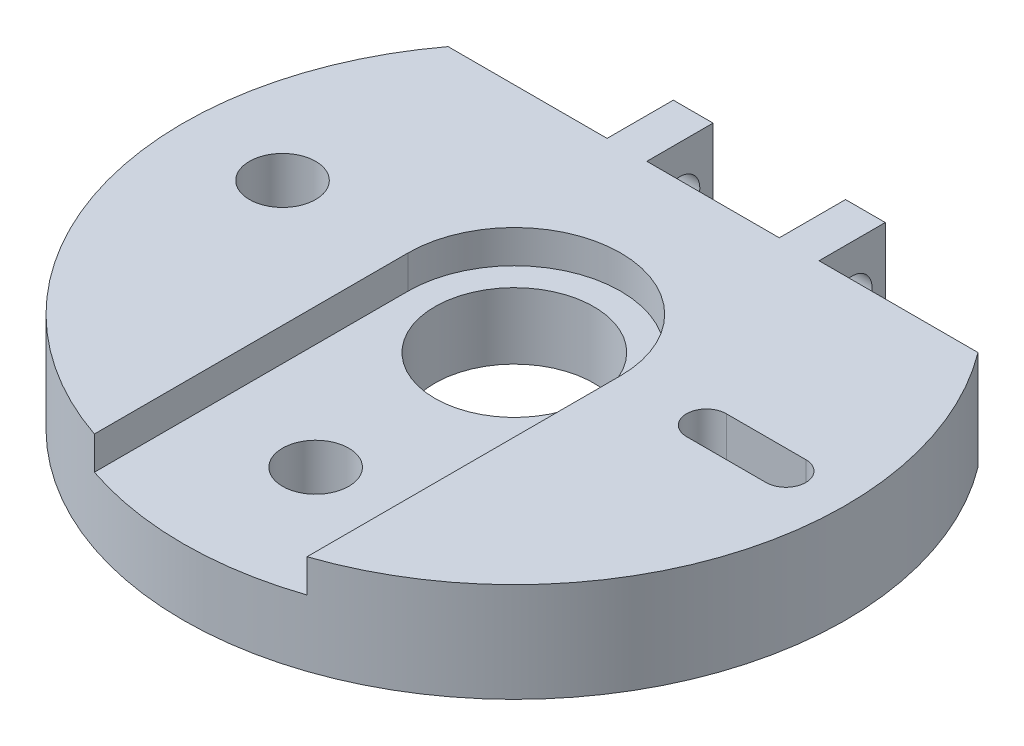
ISO-10303-21;
HEADER;
FILE_DESCRIPTION(('STEP AP214'),'2;1');
FILE_NAME('part.step','',(''),(''),'','','');
FILE_SCHEMA(('AUTOMOTIVE_DESIGN { 1 0 10303 214 1 1 1 1 }'));
ENDSEC;
DATA;
#1=APPLICATION_CONTEXT('core data for automotive mechanical design processes');
#2=APPLICATION_PROTOCOL_DEFINITION('international standard','automotive_design',2000,#1);
#3=PRODUCT_CONTEXT('',#1,'mechanical');
#4=PRODUCT('Part','Part','',(#3));
#5=PRODUCT_RELATED_PRODUCT_CATEGORY('part','',(#4));
#6=PRODUCT_DEFINITION_FORMATION('','',#4);
#7=PRODUCT_DEFINITION_CONTEXT('part definition',#1,'design');
#8=PRODUCT_DEFINITION('design','',#6,#7);
#9=PRODUCT_DEFINITION_SHAPE('','',#8);
#10=(LENGTH_UNIT() NAMED_UNIT(*) SI_UNIT(.MILLI.,.METRE.));
#11=(NAMED_UNIT(*) PLANE_ANGLE_UNIT() SI_UNIT($,.RADIAN.));
#12=(NAMED_UNIT(*) SI_UNIT($,.STERADIAN.) SOLID_ANGLE_UNIT());
#13=UNCERTAINTY_MEASURE_WITH_UNIT(LENGTH_MEASURE(1.E-05),#10,'distance_accuracy_value','');
#14=(GEOMETRIC_REPRESENTATION_CONTEXT(3) GLOBAL_UNCERTAINTY_ASSIGNED_CONTEXT((#13)) GLOBAL_UNIT_ASSIGNED_CONTEXT((#10,
#11,#12)) REPRESENTATION_CONTEXT('',''));
#15=CARTESIAN_POINT('',(0.,0.,0.));
#16=DIRECTION('',(0.,0.,1.));
#17=DIRECTION('',(1.,0.,0.));
#18=AXIS2_PLACEMENT_3D('',#15,#16,#17);
#19=CARTESIAN_POINT('',(0.,7.5,0.));
#20=DIRECTION('',(0.,-1.,0.));
#21=DIRECTION('',(0.,0.,-1.));
#22=AXIS2_PLACEMENT_3D('',#19,#20,#21);
#23=CYLINDRICAL_SURFACE('',#22,50.);
#24=DIRECTION('',(0.,1.,0.));
#25=VECTOR('',#24,1.);
#26=CARTESIAN_POINT('',(16.05,2.5,47.3539597077161));
#27=LINE('',#26,#25);
#28=CARTESIAN_POINT('',(16.05,2.5,47.3539597077161));
#29=VERTEX_POINT('',#28);
#30=CARTESIAN_POINT('',(16.05,7.5,47.3539597077161));
#31=VERTEX_POINT('',#30);
#32=EDGE_CURVE('E132',#29,#31,#27,.T.);
#33=ORIENTED_EDGE('',*,*,#32,.F.);
#34=CARTESIAN_POINT('',(0.,2.5,0.));
#35=DIRECTION('',(0.,1.,0.));
#36=DIRECTION('',(0.,0.,1.));
#37=AXIS2_PLACEMENT_3D('',#34,#35,#36);
#38=CIRCLE('',#37,50.);
#39=CARTESIAN_POINT('',(-16.05,2.5,47.3539597077161));
#40=VERTEX_POINT('',#39);
#41=EDGE_CURVE('E278',#40,#29,#38,.T.);
#42=ORIENTED_EDGE('',*,*,#41,.F.);
#43=DIRECTION('',(0.,1.,0.));
#44=VECTOR('',#43,1.);
#45=CARTESIAN_POINT('',(-16.05,2.5,47.3539597077161));
#46=LINE('',#45,#44);
#47=CARTESIAN_POINT('',(-16.05,7.5,47.3539597077161));
#48=VERTEX_POINT('',#47);
#49=EDGE_CURVE('E269',#40,#48,#46,.T.);
#50=ORIENTED_EDGE('',*,*,#49,.T.);
#51=CARTESIAN_POINT('',(0.,7.5,0.));
#52=DIRECTION('',(0.,1.,0.));
#53=DIRECTION('',(0.,0.,1.));
#54=AXIS2_PLACEMENT_3D('',#51,#52,#53);
#55=CIRCLE('',#54,50.);
#56=CARTESIAN_POINT('',(-40.,7.5,-30.));
#57=VERTEX_POINT('',#56);
#58=EDGE_CURVE('E252',#57,#48,#55,.T.);
#59=ORIENTED_EDGE('',*,*,#58,.F.);
#60=DIRECTION('',(0.,-1.,0.));
#61=VECTOR('',#60,1.);
#62=CARTESIAN_POINT('',(-40.,7.5,-30.));
#63=LINE('',#62,#61);
#64=CARTESIAN_POINT('',(-40.,-7.5,-30.));
#65=VERTEX_POINT('',#64);
#66=EDGE_CURVE('E148',#57,#65,#63,.T.);
#67=ORIENTED_EDGE('',*,*,#66,.T.);
#68=CARTESIAN_POINT('',(0.,-7.5,0.));
#69=DIRECTION('',(0.,1.,0.));
#70=DIRECTION('',(0.,0.,1.));
#71=AXIS2_PLACEMENT_3D('',#68,#69,#70);
#72=CIRCLE('',#71,50.);
#73=CARTESIAN_POINT('',(40.,-7.5,-30.));
#74=VERTEX_POINT('',#73);
#75=EDGE_CURVE('E207',#65,#74,#72,.T.);
#76=ORIENTED_EDGE('',*,*,#75,.T.);
#77=DIRECTION('',(0.,-1.,0.));
#78=VECTOR('',#77,1.);
#79=CARTESIAN_POINT('',(40.,7.5,-30.));
#80=LINE('',#79,#78);
#81=CARTESIAN_POINT('',(40.,7.5,-30.));
#82=VERTEX_POINT('',#81);
#83=EDGE_CURVE('E161',#82,#74,#80,.T.);
#84=ORIENTED_EDGE('',*,*,#83,.F.);
#85=EDGE_CURVE('E254',#31,#82,#55,.T.);
#86=ORIENTED_EDGE('',*,*,#85,.F.);
#87=EDGE_LOOP('',(#33,#42,#50,#59,#67,#76,#84,#86));
#88=FACE_BOUND('',#87,.T.);
#89=ADVANCED_FACE('F42',(#88),#23,.T.);
#90=CARTESIAN_POINT('',(0.,7.5,0.));
#91=DIRECTION('',(0.,-1.,0.));
#92=DIRECTION('',(0.,0.,-1.));
#93=AXIS2_PLACEMENT_3D('',#90,#91,#92);
#94=CYLINDRICAL_SURFACE('',#93,12.);
#95=CARTESIAN_POINT('',(0.,-7.5,0.));
#96=DIRECTION('',(0.,1.,0.));
#97=DIRECTION('',(0.,0.,1.));
#98=AXIS2_PLACEMENT_3D('',#95,#96,#97);
#99=CIRCLE('',#98,12.);
#100=CARTESIAN_POINT('',(0.,-7.5,12.));
#101=VERTEX_POINT('',#100);
#102=EDGE_CURVE('E213',#101,#101,#99,.T.);
#103=ORIENTED_EDGE('',*,*,#102,.F.);
#104=EDGE_LOOP('',(#103));
#105=FACE_BOUND('',#104,.T.);
#106=CARTESIAN_POINT('',(0.,2.5,0.));
#107=DIRECTION('',(0.,1.,0.));
#108=DIRECTION('',(0.,0.,1.));
#109=AXIS2_PLACEMENT_3D('',#106,#107,#108);
#110=CIRCLE('',#109,12.);
#111=CARTESIAN_POINT('',(0.,2.5,12.));
#112=VERTEX_POINT('',#111);
#113=EDGE_CURVE('E285',#112,#112,#110,.F.);
#114=ORIENTED_EDGE('',*,*,#113,.F.);
#115=EDGE_LOOP('',(#114));
#116=FACE_BOUND('',#115,.T.);
#117=ADVANCED_FACE('F351',(#105,#116),#94,.F.);
#118=CARTESIAN_POINT('',(0.,7.5,30.));
#119=DIRECTION('',(0.,-1.,0.));
#120=DIRECTION('',(0.,0.,-1.));
#121=AXIS2_PLACEMENT_3D('',#118,#119,#120);
#122=CYLINDRICAL_SURFACE('',#121,5.);
#123=CARTESIAN_POINT('',(0.,-7.5,30.));
#124=DIRECTION('',(0.,1.,0.));
#125=DIRECTION('',(0.,0.,1.));
#126=AXIS2_PLACEMENT_3D('',#123,#124,#125);
#127=CIRCLE('',#126,5.);
#128=CARTESIAN_POINT('',(0.,-7.5,35.));
#129=VERTEX_POINT('',#128);
#130=EDGE_CURVE('E216',#129,#129,#127,.T.);
#131=ORIENTED_EDGE('',*,*,#130,.F.);
#132=EDGE_LOOP('',(#131));
#133=FACE_BOUND('',#132,.T.);
#134=CARTESIAN_POINT('',(0.,2.5,30.));
#135=DIRECTION('',(0.,1.,0.));
#136=DIRECTION('',(0.,0.,1.));
#137=AXIS2_PLACEMENT_3D('',#134,#135,#136);
#138=CIRCLE('',#137,5.);
#139=CARTESIAN_POINT('',(0.,2.5,35.));
#140=VERTEX_POINT('',#139);
#141=EDGE_CURVE('E273',#140,#140,#138,.F.);
#142=ORIENTED_EDGE('',*,*,#141,.F.);
#143=EDGE_LOOP('',(#142));
#144=FACE_BOUND('',#143,.T.);
#145=ADVANCED_FACE('F357',(#133,#144),#122,.F.);
#146=CARTESIAN_POINT('',(0.,7.5,0.));
#147=DIRECTION('',(0.,1.,0.));
#148=DIRECTION('',(0.,0.,1.));
#149=AXIS2_PLACEMENT_3D('',#146,#147,#148);
#150=PLANE('',#149);
#151=CARTESIAN_POINT('',(-35.,7.5,0.));
#152=DIRECTION('',(0.,1.,0.));
#153=DIRECTION('',(0.,0.,1.));
#154=AXIS2_PLACEMENT_3D('',#151,#152,#153);
#155=CIRCLE('',#154,5.);
#156=CARTESIAN_POINT('',(-35.,7.5,5.));
#157=VERTEX_POINT('',#156);
#158=EDGE_CURVE('E289',#157,#157,#155,.T.);
#159=ORIENTED_EDGE('',*,*,#158,.F.);
#160=EDGE_LOOP('',(#159));
#161=FACE_BOUND('',#160,.T.);
#162=CARTESIAN_POINT('',(41.,7.5,0.));
#163=DIRECTION('',(0.,1.,0.));
#164=DIRECTION('',(0.,0.,1.));
#165=AXIS2_PLACEMENT_3D('',#162,#163,#164);
#166=CIRCLE('',#165,3.);
#167=CARTESIAN_POINT('',(41.,7.5,3.));
#168=VERTEX_POINT('',#167);
#169=CARTESIAN_POINT('',(41.,7.5,-3.));
#170=VERTEX_POINT('',#169);
#171=EDGE_CURVE('E185',#168,#170,#166,.T.);
#172=ORIENTED_EDGE('',*,*,#171,.F.);
#173=DIRECTION('',(1.,0.,0.));
#174=VECTOR('',#173,1.);
#175=CARTESIAN_POINT('',(0.,7.5,3.));
#176=LINE('',#175,#174);
#177=CARTESIAN_POINT('',(29.,7.5,3.));
#178=VERTEX_POINT('',#177);
#179=EDGE_CURVE('E263',#178,#168,#176,.T.);
#180=ORIENTED_EDGE('',*,*,#179,.F.);
#181=CARTESIAN_POINT('',(29.,7.5,0.));
#182=DIRECTION('',(0.,1.,0.));
#183=DIRECTION('',(0.,0.,1.));
#184=AXIS2_PLACEMENT_3D('',#181,#182,#183);
#185=CIRCLE('',#184,3.);
#186=CARTESIAN_POINT('',(29.,7.5,-3.));
#187=VERTEX_POINT('',#186);
#188=EDGE_CURVE('E260',#187,#178,#185,.T.);
#189=ORIENTED_EDGE('',*,*,#188,.F.);
#190=DIRECTION('',(1.,0.,0.));
#191=VECTOR('',#190,1.);
#192=CARTESIAN_POINT('',(0.,7.5,-3.));
#193=LINE('',#192,#191);
#194=EDGE_CURVE('E257',#187,#170,#193,.T.);
#195=ORIENTED_EDGE('',*,*,#194,.T.);
#196=EDGE_LOOP('',(#172,#180,#189,#195));
#197=FACE_BOUND('',#196,.T.);
#198=CARTESIAN_POINT('',(0.,7.5,0.));
#199=DIRECTION('',(0.,1.,0.));
#200=DIRECTION('',(0.,0.,1.));
#201=AXIS2_PLACEMENT_3D('',#198,#199,#200);
#202=CIRCLE('',#201,16.05);
#203=CARTESIAN_POINT('',(16.05,7.5,0.));
#204=VERTEX_POINT('',#203);
#205=CARTESIAN_POINT('',(-16.05,7.5,0.));
#206=VERTEX_POINT('',#205);
#207=EDGE_CURVE('E51',#204,#206,#202,.T.);
#208=ORIENTED_EDGE('',*,*,#207,.F.);
#209=DIRECTION('',(0.,0.,1.));
#210=VECTOR('',#209,1.);
#211=CARTESIAN_POINT('',(16.05,7.5,0.));
#212=LINE('',#211,#210);
#213=EDGE_CURVE('E11',#204,#31,#212,.T.);
#214=ORIENTED_EDGE('',*,*,#213,.T.);
#215=ORIENTED_EDGE('',*,*,#85,.T.);
#216=DIRECTION('',(-1.,0.,0.));
#217=VECTOR('',#216,1.);
#218=CARTESIAN_POINT('',(0.,7.5,-30.));
#219=LINE('',#218,#217);
#220=CARTESIAN_POINT('',(16.,7.5,-30.));
#221=VERTEX_POINT('',#220);
#222=EDGE_CURVE('E249',#82,#221,#219,.T.);
#223=ORIENTED_EDGE('',*,*,#222,.T.);
#224=DIRECTION('',(0.,0.,-1.));
#225=VECTOR('',#224,1.);
#226=CARTESIAN_POINT('',(16.,7.5,0.));
#227=LINE('',#226,#225);
#228=CARTESIAN_POINT('',(16.,7.5,-40.));
#229=VERTEX_POINT('',#228);
#230=EDGE_CURVE('E246',#221,#229,#227,.T.);
#231=ORIENTED_EDGE('',*,*,#230,.T.);
#232=DIRECTION('',(-1.,0.,0.));
#233=VECTOR('',#232,1.);
#234=CARTESIAN_POINT('',(0.,7.5,-40.));
#235=LINE('',#234,#233);
#236=CARTESIAN_POINT('',(10.,7.5,-40.));
#237=VERTEX_POINT('',#236);
#238=EDGE_CURVE('E243',#229,#237,#235,.T.);
#239=ORIENTED_EDGE('',*,*,#238,.T.);
#240=DIRECTION('',(0.,0.,1.));
#241=VECTOR('',#240,1.);
#242=CARTESIAN_POINT('',(10.,7.5,0.));
#243=LINE('',#242,#241);
#244=CARTESIAN_POINT('',(10.,7.5,-30.));
#245=VERTEX_POINT('',#244);
#246=EDGE_CURVE('E240',#237,#245,#243,.T.);
#247=ORIENTED_EDGE('',*,*,#246,.T.);
#248=DIRECTION('',(1.,0.,0.));
#249=VECTOR('',#248,1.);
#250=CARTESIAN_POINT('',(0.,7.5,-30.));
#251=LINE('',#250,#249);
#252=CARTESIAN_POINT('',(-9.99999999999999,7.5,-30.));
#253=VERTEX_POINT('',#252);
#254=EDGE_CURVE('E237',#253,#245,#251,.T.);
#255=ORIENTED_EDGE('',*,*,#254,.F.);
#256=DIRECTION('',(0.,0.,1.));
#257=VECTOR('',#256,1.);
#258=CARTESIAN_POINT('',(-9.99999999999999,7.5,0.));
#259=LINE('',#258,#257);
#260=CARTESIAN_POINT('',(-9.99999999999999,7.5,-40.));
#261=VERTEX_POINT('',#260);
#262=EDGE_CURVE('E234',#261,#253,#259,.T.);
#263=ORIENTED_EDGE('',*,*,#262,.F.);
#264=DIRECTION('',(1.,0.,0.));
#265=VECTOR('',#264,1.);
#266=CARTESIAN_POINT('',(0.,7.5,-40.));
#267=LINE('',#266,#265);
#268=CARTESIAN_POINT('',(-16.,7.5,-40.));
#269=VERTEX_POINT('',#268);
#270=EDGE_CURVE('E231',#269,#261,#267,.T.);
#271=ORIENTED_EDGE('',*,*,#270,.F.);
#272=DIRECTION('',(0.,0.,-1.));
#273=VECTOR('',#272,1.);
#274=CARTESIAN_POINT('',(-16.,7.5,0.));
#275=LINE('',#274,#273);
#276=CARTESIAN_POINT('',(-16.,7.5,-30.));
#277=VERTEX_POINT('',#276);
#278=EDGE_CURVE('E159',#277,#269,#275,.T.);
#279=ORIENTED_EDGE('',*,*,#278,.F.);
#280=DIRECTION('',(1.,0.,0.));
#281=VECTOR('',#280,1.);
#282=CARTESIAN_POINT('',(0.,7.5,-30.));
#283=LINE('',#282,#281);
#284=EDGE_CURVE('E255',#57,#277,#283,.T.);
#285=ORIENTED_EDGE('',*,*,#284,.F.);
#286=ORIENTED_EDGE('',*,*,#58,.T.);
#287=DIRECTION('',(0.,0.,1.));
#288=VECTOR('',#287,1.);
#289=CARTESIAN_POINT('',(-16.05,7.5,0.));
#290=LINE('',#289,#288);
#291=EDGE_CURVE('E147',#206,#48,#290,.T.);
#292=ORIENTED_EDGE('',*,*,#291,.F.);
#293=EDGE_LOOP('',(#208,#214,#215,#223,#231,#239,#247,#255,#263,#271,#279,#285,#286,#292));
#294=FACE_BOUND('',#293,.T.);
#295=ADVANCED_FACE('F145',(#161,#197,#294),#150,.T.);
#296=CARTESIAN_POINT('',(0.,7.5,-30.));
#297=DIRECTION('',(0.,0.,-1.));
#298=DIRECTION('',(-1.,0.,0.));
#299=AXIS2_PLACEMENT_3D('',#296,#297,#298);
#300=PLANE('',#299);
#301=DIRECTION('',(1.,0.,0.));
#302=VECTOR('',#301,1.);
#303=CARTESIAN_POINT('',(0.,-7.5,-30.));
#304=LINE('',#303,#302);
#305=CARTESIAN_POINT('',(-16.,-7.5,-30.));
#306=VERTEX_POINT('',#305);
#307=EDGE_CURVE('E210',#65,#306,#304,.T.);
#308=ORIENTED_EDGE('',*,*,#307,.F.);
#309=ORIENTED_EDGE('',*,*,#66,.F.);
#310=ORIENTED_EDGE('',*,*,#284,.T.);
#311=DIRECTION('',(0.,-1.,0.));
#312=VECTOR('',#311,1.);
#313=CARTESIAN_POINT('',(-16.,7.5,-30.));
#314=LINE('',#313,#312);
#315=EDGE_CURVE('E68',#277,#306,#314,.T.);
#316=ORIENTED_EDGE('',*,*,#315,.T.);
#317=EDGE_LOOP('',(#308,#309,#310,#316));
#318=FACE_BOUND('',#317,.T.);
#319=ADVANCED_FACE('F364',(#318),#300,.T.);
#320=CARTESIAN_POINT('',(0.,7.5,-30.));
#321=DIRECTION('',(0.,0.,1.));
#322=DIRECTION('',(1.,0.,0.));
#323=AXIS2_PLACEMENT_3D('',#320,#321,#322);
#324=PLANE('',#323);
#325=DIRECTION('',(-1.,0.,0.));
#326=VECTOR('',#325,1.);
#327=CARTESIAN_POINT('',(0.,-7.5,-30.));
#328=LINE('',#327,#326);
#329=CARTESIAN_POINT('',(16.,-7.5,-30.));
#330=VERTEX_POINT('',#329);
#331=EDGE_CURVE('E204',#74,#330,#328,.T.);
#332=ORIENTED_EDGE('',*,*,#331,.T.);
#333=DIRECTION('',(0.,-1.,0.));
#334=VECTOR('',#333,1.);
#335=CARTESIAN_POINT('',(16.,7.5,-30.));
#336=LINE('',#335,#334);
#337=EDGE_CURVE('E164',#221,#330,#336,.T.);
#338=ORIENTED_EDGE('',*,*,#337,.F.);
#339=ORIENTED_EDGE('',*,*,#222,.F.);
#340=ORIENTED_EDGE('',*,*,#83,.T.);
#341=EDGE_LOOP('',(#332,#338,#339,#340));
#342=FACE_BOUND('',#341,.T.);
#343=ADVANCED_FACE('F362',(#342),#324,.F.);
#344=CARTESIAN_POINT('',(16.,7.5,0.));
#345=DIRECTION('',(-1.,0.,0.));
#346=DIRECTION('',(0.,0.,1.));
#347=AXIS2_PLACEMENT_3D('',#344,#345,#346);
#348=PLANE('',#347);
#349=CARTESIAN_POINT('',(16.,0.,-35.));
#350=DIRECTION('',(-1.,0.,0.));
#351=DIRECTION('',(0.,0.,1.));
#352=AXIS2_PLACEMENT_3D('',#349,#350,#351);
#353=CIRCLE('',#352,3.);
#354=CARTESIAN_POINT('',(16.,0.,-32.));
#355=VERTEX_POINT('',#354);
#356=EDGE_CURVE('E300',#355,#355,#353,.T.);
#357=ORIENTED_EDGE('',*,*,#356,.T.);
#358=EDGE_LOOP('',(#357));
#359=FACE_BOUND('',#358,.T.);
#360=DIRECTION('',(0.,0.,-1.));
#361=VECTOR('',#360,1.);
#362=CARTESIAN_POINT('',(16.,-7.5,0.));
#363=LINE('',#362,#361);
#364=CARTESIAN_POINT('',(16.,-7.5,-40.));
#365=VERTEX_POINT('',#364);
#366=EDGE_CURVE('E201',#330,#365,#363,.T.);
#367=ORIENTED_EDGE('',*,*,#366,.T.);
#368=DIRECTION('',(0.,-1.,0.));
#369=VECTOR('',#368,1.);
#370=CARTESIAN_POINT('',(16.,7.5,-40.));
#371=LINE('',#370,#369);
#372=EDGE_CURVE('E167',#229,#365,#371,.T.);
#373=ORIENTED_EDGE('',*,*,#372,.F.);
#374=ORIENTED_EDGE('',*,*,#230,.F.);
#375=ORIENTED_EDGE('',*,*,#337,.T.);
#376=EDGE_LOOP('',(#367,#373,#374,#375));
#377=FACE_BOUND('',#376,.T.);
#378=ADVANCED_FACE('F428',(#359,#377),#348,.F.);
#379=CARTESIAN_POINT('',(0.,7.5,-40.));
#380=DIRECTION('',(0.,0.,1.));
#381=DIRECTION('',(1.,0.,0.));
#382=AXIS2_PLACEMENT_3D('',#379,#380,#381);
#383=PLANE('',#382);
#384=DIRECTION('',(-1.,0.,0.));
#385=VECTOR('',#384,1.);
#386=CARTESIAN_POINT('',(0.,-7.5,-40.));
#387=LINE('',#386,#385);
#388=CARTESIAN_POINT('',(10.,-7.5,-40.));
#389=VERTEX_POINT('',#388);
#390=EDGE_CURVE('E198',#365,#389,#387,.T.);
#391=ORIENTED_EDGE('',*,*,#390,.T.);
#392=DIRECTION('',(0.,-1.,0.));
#393=VECTOR('',#392,1.);
#394=CARTESIAN_POINT('',(10.,7.5,-40.));
#395=LINE('',#394,#393);
#396=EDGE_CURVE('E170',#237,#389,#395,.T.);
#397=ORIENTED_EDGE('',*,*,#396,.F.);
#398=ORIENTED_EDGE('',*,*,#238,.F.);
#399=ORIENTED_EDGE('',*,*,#372,.T.);
#400=EDGE_LOOP('',(#391,#397,#398,#399));
#401=FACE_BOUND('',#400,.T.);
#402=ADVANCED_FACE('F426',(#401),#383,.F.);
#403=CARTESIAN_POINT('',(10.,7.5,0.));
#404=DIRECTION('',(1.,0.,0.));
#405=DIRECTION('',(0.,0.,-1.));
#406=AXIS2_PLACEMENT_3D('',#403,#404,#405);
#407=PLANE('',#406);
#408=CARTESIAN_POINT('',(10.,0.,-35.));
#409=DIRECTION('',(1.,0.,0.));
#410=DIRECTION('',(0.,0.,-1.));
#411=AXIS2_PLACEMENT_3D('',#408,#409,#410);
#412=CIRCLE('',#411,3.);
#413=CARTESIAN_POINT('',(10.,0.,-38.));
#414=VERTEX_POINT('',#413);
#415=EDGE_CURVE('E303',#414,#414,#412,.T.);
#416=ORIENTED_EDGE('',*,*,#415,.T.);
#417=EDGE_LOOP('',(#416));
#418=FACE_BOUND('',#417,.T.);
#419=DIRECTION('',(0.,0.,1.));
#420=VECTOR('',#419,1.);
#421=CARTESIAN_POINT('',(10.,-7.5,0.));
#422=LINE('',#421,#420);
#423=CARTESIAN_POINT('',(10.,-7.5,-30.));
#424=VERTEX_POINT('',#423);
#425=EDGE_CURVE('E195',#389,#424,#422,.T.);
#426=ORIENTED_EDGE('',*,*,#425,.T.);
#427=DIRECTION('',(0.,-1.,0.));
#428=VECTOR('',#427,1.);
#429=CARTESIAN_POINT('',(10.,7.5,-30.));
#430=LINE('',#429,#428);
#431=EDGE_CURVE('E173',#245,#424,#430,.T.);
#432=ORIENTED_EDGE('',*,*,#431,.F.);
#433=ORIENTED_EDGE('',*,*,#246,.F.);
#434=ORIENTED_EDGE('',*,*,#396,.T.);
#435=EDGE_LOOP('',(#426,#432,#433,#434));
#436=FACE_BOUND('',#435,.T.);
#437=ADVANCED_FACE('F423',(#418,#436),#407,.F.);
#438=CARTESIAN_POINT('',(0.,7.5,-30.));
#439=DIRECTION('',(0.,0.,-1.));
#440=DIRECTION('',(-1.,0.,0.));
#441=AXIS2_PLACEMENT_3D('',#438,#439,#440);
#442=PLANE('',#441);
#443=DIRECTION('',(1.,0.,0.));
#444=VECTOR('',#443,1.);
#445=CARTESIAN_POINT('',(0.,-7.5,-30.));
#446=LINE('',#445,#444);
#447=CARTESIAN_POINT('',(-9.99999999999999,-7.5,-30.));
#448=VERTEX_POINT('',#447);
#449=EDGE_CURVE('E192',#448,#424,#446,.T.);
#450=ORIENTED_EDGE('',*,*,#449,.F.);
#451=DIRECTION('',(0.,-1.,0.));
#452=VECTOR('',#451,1.);
#453=CARTESIAN_POINT('',(-9.99999999999999,7.5,-30.));
#454=LINE('',#453,#452);
#455=EDGE_CURVE('E175',#253,#448,#454,.T.);
#456=ORIENTED_EDGE('',*,*,#455,.F.);
#457=ORIENTED_EDGE('',*,*,#254,.T.);
#458=ORIENTED_EDGE('',*,*,#431,.T.);
#459=EDGE_LOOP('',(#450,#456,#457,#458));
#460=FACE_BOUND('',#459,.T.);
#461=ADVANCED_FACE('F319',(#460),#442,.T.);
#462=CARTESIAN_POINT('',(-9.99999999999999,7.5,0.));
#463=DIRECTION('',(1.,0.,0.));
#464=DIRECTION('',(0.,0.,-1.));
#465=AXIS2_PLACEMENT_3D('',#462,#463,#464);
#466=PLANE('',#465);
#467=CARTESIAN_POINT('',(-9.99999999999999,0.,-35.));
#468=DIRECTION('',(1.,0.,0.));
#469=DIRECTION('',(0.,0.,-1.));
#470=AXIS2_PLACEMENT_3D('',#467,#468,#469);
#471=CIRCLE('',#470,3.);
#472=CARTESIAN_POINT('',(-9.99999999999999,0.,-38.));
#473=VERTEX_POINT('',#472);
#474=EDGE_CURVE('E46',#473,#473,#471,.T.);
#475=ORIENTED_EDGE('',*,*,#474,.F.);
#476=EDGE_LOOP('',(#475));
#477=FACE_BOUND('',#476,.T.);
#478=DIRECTION('',(0.,0.,1.));
#479=VECTOR('',#478,1.);
#480=CARTESIAN_POINT('',(-9.99999999999999,-7.5,0.));
#481=LINE('',#480,#479);
#482=CARTESIAN_POINT('',(-9.99999999999999,-7.5,-40.));
#483=VERTEX_POINT('',#482);
#484=EDGE_CURVE('E189',#483,#448,#481,.T.);
#485=ORIENTED_EDGE('',*,*,#484,.F.);
#486=DIRECTION('',(0.,-1.,0.));
#487=VECTOR('',#486,1.);
#488=CARTESIAN_POINT('',(-9.99999999999999,7.5,-40.));
#489=LINE('',#488,#487);
#490=EDGE_CURVE('E177',#261,#483,#489,.T.);
#491=ORIENTED_EDGE('',*,*,#490,.F.);
#492=ORIENTED_EDGE('',*,*,#262,.T.);
#493=ORIENTED_EDGE('',*,*,#455,.T.);
#494=EDGE_LOOP('',(#485,#491,#492,#493));
#495=FACE_BOUND('',#494,.T.);
#496=ADVANCED_FACE('F315',(#477,#495),#466,.T.);
#497=CARTESIAN_POINT('',(0.,7.5,-40.));
#498=DIRECTION('',(0.,0.,-1.));
#499=DIRECTION('',(-1.,0.,0.));
#500=AXIS2_PLACEMENT_3D('',#497,#498,#499);
#501=PLANE('',#500);
#502=DIRECTION('',(1.,0.,0.));
#503=VECTOR('',#502,1.);
#504=CARTESIAN_POINT('',(0.,-7.5,-40.));
#505=LINE('',#504,#503);
#506=CARTESIAN_POINT('',(-16.,-7.5,-40.));
#507=VERTEX_POINT('',#506);
#508=EDGE_CURVE('E186',#507,#483,#505,.T.);
#509=ORIENTED_EDGE('',*,*,#508,.F.);
#510=DIRECTION('',(0.,-1.,0.));
#511=VECTOR('',#510,1.);
#512=CARTESIAN_POINT('',(-16.,7.5,-40.));
#513=LINE('',#512,#511);
#514=EDGE_CURVE('E179',#269,#507,#513,.T.);
#515=ORIENTED_EDGE('',*,*,#514,.F.);
#516=ORIENTED_EDGE('',*,*,#270,.T.);
#517=ORIENTED_EDGE('',*,*,#490,.T.);
#518=EDGE_LOOP('',(#509,#515,#516,#517));
#519=FACE_BOUND('',#518,.T.);
#520=ADVANCED_FACE('F318',(#519),#501,.T.);
#521=CARTESIAN_POINT('',(41.,7.5,0.));
#522=DIRECTION('',(0.,-1.,0.));
#523=DIRECTION('',(0.,0.,-1.));
#524=AXIS2_PLACEMENT_3D('',#521,#522,#523);
#525=CYLINDRICAL_SURFACE('',#524,3.);
#526=CARTESIAN_POINT('',(41.,-7.5,0.));
#527=DIRECTION('',(0.,1.,0.));
#528=DIRECTION('',(0.,0.,1.));
#529=AXIS2_PLACEMENT_3D('',#526,#527,#528);
#530=CIRCLE('',#529,3.);
#531=CARTESIAN_POINT('',(41.,-7.5,3.));
#532=VERTEX_POINT('',#531);
#533=CARTESIAN_POINT('',(41.,-7.5,-3.));
#534=VERTEX_POINT('',#533);
#535=EDGE_CURVE('E143',#532,#534,#530,.T.);
#536=ORIENTED_EDGE('',*,*,#535,.F.);
#537=DIRECTION('',(0.,-1.,0.));
#538=VECTOR('',#537,1.);
#539=CARTESIAN_POINT('',(41.,7.5,3.));
#540=LINE('',#539,#538);
#541=EDGE_CURVE('E151',#168,#532,#540,.T.);
#542=ORIENTED_EDGE('',*,*,#541,.F.);
#543=ORIENTED_EDGE('',*,*,#171,.T.);
#544=DIRECTION('',(0.,-1.,0.));
#545=VECTOR('',#544,1.);
#546=CARTESIAN_POINT('',(41.,7.5,-3.));
#547=LINE('',#546,#545);
#548=EDGE_CURVE('E157',#170,#534,#547,.T.);
#549=ORIENTED_EDGE('',*,*,#548,.T.);
#550=EDGE_LOOP('',(#536,#542,#543,#549));
#551=FACE_BOUND('',#550,.T.);
#552=ADVANCED_FACE('F44',(#551),#525,.F.);
#553=CARTESIAN_POINT('',(0.,7.5,3.));
#554=DIRECTION('',(0.,0.,-1.));
#555=DIRECTION('',(-1.,0.,0.));
#556=AXIS2_PLACEMENT_3D('',#553,#554,#555);
#557=PLANE('',#556);
#558=DIRECTION('',(1.,0.,0.));
#559=VECTOR('',#558,1.);
#560=CARTESIAN_POINT('',(0.,-7.5,3.));
#561=LINE('',#560,#559);
#562=CARTESIAN_POINT('',(29.,-7.5,3.));
#563=VERTEX_POINT('',#562);
#564=EDGE_CURVE('E225',#563,#532,#561,.T.);
#565=ORIENTED_EDGE('',*,*,#564,.F.);
#566=DIRECTION('',(0.,-1.,0.));
#567=VECTOR('',#566,1.);
#568=CARTESIAN_POINT('',(29.,7.5,3.));
#569=LINE('',#568,#567);
#570=EDGE_CURVE('E153',#178,#563,#569,.T.);
#571=ORIENTED_EDGE('',*,*,#570,.F.);
#572=ORIENTED_EDGE('',*,*,#179,.T.);
#573=ORIENTED_EDGE('',*,*,#541,.T.);
#574=EDGE_LOOP('',(#565,#571,#572,#573));
#575=FACE_BOUND('',#574,.T.);
#576=ADVANCED_FACE('F372',(#575),#557,.T.);
#577=CARTESIAN_POINT('',(29.,7.5,0.));
#578=DIRECTION('',(0.,-1.,0.));
#579=DIRECTION('',(0.,0.,-1.));
#580=AXIS2_PLACEMENT_3D('',#577,#578,#579);
#581=CYLINDRICAL_SURFACE('',#580,3.);
#582=CARTESIAN_POINT('',(29.,-7.5,0.));
#583=DIRECTION('',(0.,1.,0.));
#584=DIRECTION('',(0.,0.,1.));
#585=AXIS2_PLACEMENT_3D('',#582,#583,#584);
#586=CIRCLE('',#585,3.);
#587=CARTESIAN_POINT('',(29.,-7.5,-3.));
#588=VERTEX_POINT('',#587);
#589=EDGE_CURVE('E222',#588,#563,#586,.T.);
#590=ORIENTED_EDGE('',*,*,#589,.F.);
#591=DIRECTION('',(0.,-1.,0.));
#592=VECTOR('',#591,1.);
#593=CARTESIAN_POINT('',(29.,7.5,-3.));
#594=LINE('',#593,#592);
#595=EDGE_CURVE('E155',#187,#588,#594,.T.);
#596=ORIENTED_EDGE('',*,*,#595,.F.);
#597=ORIENTED_EDGE('',*,*,#188,.T.);
#598=ORIENTED_EDGE('',*,*,#570,.T.);
#599=EDGE_LOOP('',(#590,#596,#597,#598));
#600=FACE_BOUND('',#599,.T.);
#601=ADVANCED_FACE('F346',(#600),#581,.F.);
#602=CARTESIAN_POINT('',(0.,7.5,-3.));
#603=DIRECTION('',(0.,0.,-1.));
#604=DIRECTION('',(-1.,0.,0.));
#605=AXIS2_PLACEMENT_3D('',#602,#603,#604);
#606=PLANE('',#605);
#607=DIRECTION('',(1.,0.,0.));
#608=VECTOR('',#607,1.);
#609=CARTESIAN_POINT('',(0.,-7.5,-3.));
#610=LINE('',#609,#608);
#611=EDGE_CURVE('E219',#588,#534,#610,.T.);
#612=ORIENTED_EDGE('',*,*,#611,.T.);
#613=ORIENTED_EDGE('',*,*,#548,.F.);
#614=ORIENTED_EDGE('',*,*,#194,.F.);
#615=ORIENTED_EDGE('',*,*,#595,.T.);
#616=EDGE_LOOP('',(#612,#613,#614,#615));
#617=FACE_BOUND('',#616,.T.);
#618=ADVANCED_FACE('F337',(#617),#606,.F.);
#619=CARTESIAN_POINT('',(-16.,7.5,0.));
#620=DIRECTION('',(-1.,0.,0.));
#621=DIRECTION('',(0.,0.,1.));
#622=AXIS2_PLACEMENT_3D('',#619,#620,#621);
#623=PLANE('',#622);
#624=CARTESIAN_POINT('',(-16.,0.,-35.));
#625=DIRECTION('',(-1.,0.,0.));
#626=DIRECTION('',(0.,0.,1.));
#627=AXIS2_PLACEMENT_3D('',#624,#625,#626);
#628=CIRCLE('',#627,3.);
#629=CARTESIAN_POINT('',(-16.,0.,-32.));
#630=VERTEX_POINT('',#629);
#631=EDGE_CURVE('E306',#630,#630,#628,.T.);
#632=ORIENTED_EDGE('',*,*,#631,.F.);
#633=EDGE_LOOP('',(#632));
#634=FACE_BOUND('',#633,.T.);
#635=DIRECTION('',(0.,0.,-1.));
#636=VECTOR('',#635,1.);
#637=CARTESIAN_POINT('',(-16.,-7.5,0.));
#638=LINE('',#637,#636);
#639=EDGE_CURVE('E182',#306,#507,#638,.T.);
#640=ORIENTED_EDGE('',*,*,#639,.F.);
#641=ORIENTED_EDGE('',*,*,#315,.F.);
#642=ORIENTED_EDGE('',*,*,#278,.T.);
#643=ORIENTED_EDGE('',*,*,#514,.T.);
#644=EDGE_LOOP('',(#640,#641,#642,#643));
#645=FACE_BOUND('',#644,.T.);
#646=ADVANCED_FACE('F335',(#634,#645),#623,.T.);
#647=CARTESIAN_POINT('',(0.,-7.5,0.));
#648=DIRECTION('',(0.,1.,0.));
#649=DIRECTION('',(0.,0.,1.));
#650=AXIS2_PLACEMENT_3D('',#647,#648,#649);
#651=PLANE('',#650);
#652=CARTESIAN_POINT('',(-35.,-7.5,0.));
#653=DIRECTION('',(0.,1.,0.));
#654=DIRECTION('',(0.,0.,1.));
#655=AXIS2_PLACEMENT_3D('',#652,#653,#654);
#656=CIRCLE('',#655,3.5);
#657=CARTESIAN_POINT('',(-35.,-7.5,3.5));
#658=VERTEX_POINT('',#657);
#659=EDGE_CURVE('E292',#658,#658,#656,.T.);
#660=ORIENTED_EDGE('',*,*,#659,.T.);
#661=EDGE_LOOP('',(#660));
#662=FACE_BOUND('',#661,.T.);
#663=ORIENTED_EDGE('',*,*,#535,.T.);
#664=ORIENTED_EDGE('',*,*,#611,.F.);
#665=ORIENTED_EDGE('',*,*,#589,.T.);
#666=ORIENTED_EDGE('',*,*,#564,.T.);
#667=EDGE_LOOP('',(#663,#664,#665,#666));
#668=FACE_BOUND('',#667,.T.);
#669=ORIENTED_EDGE('',*,*,#130,.T.);
#670=EDGE_LOOP('',(#669));
#671=FACE_BOUND('',#670,.T.);
#672=ORIENTED_EDGE('',*,*,#102,.T.);
#673=EDGE_LOOP('',(#672));
#674=FACE_BOUND('',#673,.T.);
#675=ORIENTED_EDGE('',*,*,#307,.T.);
#676=ORIENTED_EDGE('',*,*,#639,.T.);
#677=ORIENTED_EDGE('',*,*,#508,.T.);
#678=ORIENTED_EDGE('',*,*,#484,.T.);
#679=ORIENTED_EDGE('',*,*,#449,.T.);
#680=ORIENTED_EDGE('',*,*,#425,.F.);
#681=ORIENTED_EDGE('',*,*,#390,.F.);
#682=ORIENTED_EDGE('',*,*,#366,.F.);
#683=ORIENTED_EDGE('',*,*,#331,.F.);
#684=ORIENTED_EDGE('',*,*,#75,.F.);
#685=EDGE_LOOP('',(#675,#676,#677,#678,#679,#680,#681,#682,#683,#684));
#686=FACE_BOUND('',#685,.T.);
#687=ADVANCED_FACE('F328',(#662,#668,#671,#674,#686),#651,.F.);
#688=CARTESIAN_POINT('',(0.,2.5,0.));
#689=DIRECTION('',(0.,1.,0.));
#690=DIRECTION('',(0.,0.,1.));
#691=AXIS2_PLACEMENT_3D('',#688,#689,#690);
#692=CYLINDRICAL_SURFACE('',#691,16.05);
#693=ORIENTED_EDGE('',*,*,#207,.T.);
#694=DIRECTION('',(0.,1.,0.));
#695=VECTOR('',#694,1.);
#696=CARTESIAN_POINT('',(-16.05,2.5,0.));
#697=LINE('',#696,#695);
#698=CARTESIAN_POINT('',(-16.05,2.5,0.));
#699=VERTEX_POINT('',#698);
#700=EDGE_CURVE('E59',#699,#206,#697,.T.);
#701=ORIENTED_EDGE('',*,*,#700,.F.);
#702=CARTESIAN_POINT('',(0.,2.5,0.));
#703=DIRECTION('',(0.,1.,0.));
#704=DIRECTION('',(0.,0.,1.));
#705=AXIS2_PLACEMENT_3D('',#702,#703,#704);
#706=CIRCLE('',#705,16.05);
#707=CARTESIAN_POINT('',(16.05,2.5,0.));
#708=VERTEX_POINT('',#707);
#709=EDGE_CURVE('E142',#708,#699,#706,.T.);
#710=ORIENTED_EDGE('',*,*,#709,.F.);
#711=DIRECTION('',(0.,1.,0.));
#712=VECTOR('',#711,1.);
#713=CARTESIAN_POINT('',(16.05,2.5,0.));
#714=LINE('',#713,#712);
#715=EDGE_CURVE('E129',#708,#204,#714,.T.);
#716=ORIENTED_EDGE('',*,*,#715,.T.);
#717=EDGE_LOOP('',(#693,#701,#710,#716));
#718=FACE_BOUND('',#717,.T.);
#719=ADVANCED_FACE('F139',(#718),#692,.F.);
#720=CARTESIAN_POINT('',(16.05,2.5,0.));
#721=DIRECTION('',(-1.,0.,0.));
#722=DIRECTION('',(0.,0.,1.));
#723=AXIS2_PLACEMENT_3D('',#720,#721,#722);
#724=PLANE('',#723);
#725=ORIENTED_EDGE('',*,*,#715,.F.);
#726=DIRECTION('',(0.,0.,1.));
#727=VECTOR('',#726,1.);
#728=CARTESIAN_POINT('',(16.05,2.5,0.));
#729=LINE('',#728,#727);
#730=EDGE_CURVE('E276',#708,#29,#729,.T.);
#731=ORIENTED_EDGE('',*,*,#730,.T.);
#732=ORIENTED_EDGE('',*,*,#32,.T.);
#733=ORIENTED_EDGE('',*,*,#213,.F.);
#734=EDGE_LOOP('',(#725,#731,#732,#733));
#735=FACE_BOUND('',#734,.T.);
#736=ADVANCED_FACE('F127',(#735),#724,.T.);
#737=CARTESIAN_POINT('',(-16.05,2.5,0.));
#738=DIRECTION('',(-1.,0.,0.));
#739=DIRECTION('',(0.,0.,1.));
#740=AXIS2_PLACEMENT_3D('',#737,#738,#739);
#741=PLANE('',#740);
#742=ORIENTED_EDGE('',*,*,#291,.T.);
#743=ORIENTED_EDGE('',*,*,#49,.F.);
#744=DIRECTION('',(0.,0.,1.));
#745=VECTOR('',#744,1.);
#746=CARTESIAN_POINT('',(-16.05,2.5,0.));
#747=LINE('',#746,#745);
#748=EDGE_CURVE('E281',#699,#40,#747,.T.);
#749=ORIENTED_EDGE('',*,*,#748,.F.);
#750=ORIENTED_EDGE('',*,*,#700,.T.);
#751=EDGE_LOOP('',(#742,#743,#749,#750));
#752=FACE_BOUND('',#751,.T.);
#753=ADVANCED_FACE('F439',(#752),#741,.F.);
#754=CARTESIAN_POINT('',(0.,2.5,0.));
#755=DIRECTION('',(0.,1.,0.));
#756=DIRECTION('',(0.,0.,1.));
#757=AXIS2_PLACEMENT_3D('',#754,#755,#756);
#758=PLANE('',#757);
#759=ORIENTED_EDGE('',*,*,#113,.T.);
#760=EDGE_LOOP('',(#759));
#761=FACE_BOUND('',#760,.T.);
#762=ORIENTED_EDGE('',*,*,#709,.T.);
#763=ORIENTED_EDGE('',*,*,#748,.T.);
#764=ORIENTED_EDGE('',*,*,#41,.T.);
#765=ORIENTED_EDGE('',*,*,#730,.F.);
#766=EDGE_LOOP('',(#762,#763,#764,#765));
#767=FACE_BOUND('',#766,.T.);
#768=ORIENTED_EDGE('',*,*,#141,.T.);
#769=EDGE_LOOP('',(#768));
#770=FACE_BOUND('',#769,.T.);
#771=ADVANCED_FACE('F444',(#761,#767,#770),#758,.T.);
#772=CARTESIAN_POINT('',(-35.,-2.5,0.));
#773=DIRECTION('',(0.,1.,0.));
#774=DIRECTION('',(0.,0.,1.));
#775=AXIS2_PLACEMENT_3D('',#772,#773,#774);
#776=CYLINDRICAL_SURFACE('',#775,5.);
#777=CARTESIAN_POINT('',(-35.,-2.5,0.));
#778=DIRECTION('',(0.,1.,0.));
#779=DIRECTION('',(0.,0.,1.));
#780=AXIS2_PLACEMENT_3D('',#777,#778,#779);
#781=CIRCLE('',#780,5.);
#782=CARTESIAN_POINT('',(-35.,-2.5,5.));
#783=VERTEX_POINT('',#782);
#784=EDGE_CURVE('E288',#783,#783,#781,.T.);
#785=ORIENTED_EDGE('',*,*,#784,.F.);
#786=EDGE_LOOP('',(#785));
#787=FACE_BOUND('',#786,.T.);
#788=ORIENTED_EDGE('',*,*,#158,.T.);
#789=EDGE_LOOP('',(#788));
#790=FACE_BOUND('',#789,.T.);
#791=ADVANCED_FACE('F450',(#787,#790),#776,.F.);
#792=CARTESIAN_POINT('',(-35.,-2.5,0.));
#793=DIRECTION('',(0.,1.,0.));
#794=DIRECTION('',(0.,0.,1.));
#795=AXIS2_PLACEMENT_3D('',#792,#793,#794);
#796=PLANE('',#795);
#797=CARTESIAN_POINT('',(-35.,-2.5,0.));
#798=DIRECTION('',(0.,1.,0.));
#799=DIRECTION('',(0.,0.,1.));
#800=AXIS2_PLACEMENT_3D('',#797,#798,#799);
#801=CIRCLE('',#800,3.5);
#802=CARTESIAN_POINT('',(-35.,-2.5,3.5));
#803=VERTEX_POINT('',#802);
#804=EDGE_CURVE('E297',#803,#803,#801,.T.);
#805=ORIENTED_EDGE('',*,*,#804,.F.);
#806=EDGE_LOOP('',(#805));
#807=FACE_BOUND('',#806,.T.);
#808=ORIENTED_EDGE('',*,*,#784,.T.);
#809=EDGE_LOOP('',(#808));
#810=FACE_BOUND('',#809,.T.);
#811=ADVANCED_FACE('F459',(#807,#810),#796,.T.);
#812=CARTESIAN_POINT('',(-35.,-2.5,0.));
#813=DIRECTION('',(0.,1.,0.));
#814=DIRECTION('',(0.,0.,1.));
#815=AXIS2_PLACEMENT_3D('',#812,#813,#814);
#816=CYLINDRICAL_SURFACE('',#815,3.5);
#817=ORIENTED_EDGE('',*,*,#659,.F.);
#818=EDGE_LOOP('',(#817));
#819=FACE_BOUND('',#818,.T.);
#820=ORIENTED_EDGE('',*,*,#804,.T.);
#821=EDGE_LOOP('',(#820));
#822=FACE_BOUND('',#821,.T.);
#823=ADVANCED_FACE('F608',(#819,#822),#816,.F.);
#824=CARTESIAN_POINT('',(-16.,0.,-35.));
#825=DIRECTION('',(-1.,0.,0.));
#826=DIRECTION('',(0.,0.,1.));
#827=AXIS2_PLACEMENT_3D('',#824,#825,#826);
#828=CYLINDRICAL_SURFACE('',#827,3.);
#829=ORIENTED_EDGE('',*,*,#474,.T.);
#830=EDGE_LOOP('',(#829));
#831=FACE_BOUND('',#830,.T.);
#832=ORIENTED_EDGE('',*,*,#631,.T.);
#833=EDGE_LOOP('',(#832));
#834=FACE_BOUND('',#833,.T.);
#835=ADVANCED_FACE('F313',(#831,#834),#828,.F.);
#836=ORIENTED_EDGE('',*,*,#415,.F.);
#837=EDGE_LOOP('',(#836));
#838=FACE_BOUND('',#837,.T.);
#839=ORIENTED_EDGE('',*,*,#356,.F.);
#840=EDGE_LOOP('',(#839));
#841=FACE_BOUND('',#840,.T.);
#842=ADVANCED_FACE('F627',(#838,#841),#828,.F.);
#843=CLOSED_SHELL('',(#89,#117,#145,#295,#319,#343,#378,#402,#437,#461,#496,#520,#552,#576,#601,
#618,#646,#687,#719,#736,#753,#771,#791,#811,#823,#835,#842));
#844=MANIFOLD_SOLID_BREP('B2',#843);
#845=ADVANCED_BREP_SHAPE_REPRESENTATION('',(#18,#844),#14);
#846=SHAPE_DEFINITION_REPRESENTATION(#9,#845);
ENDSEC;
END-ISO-10303-21;
